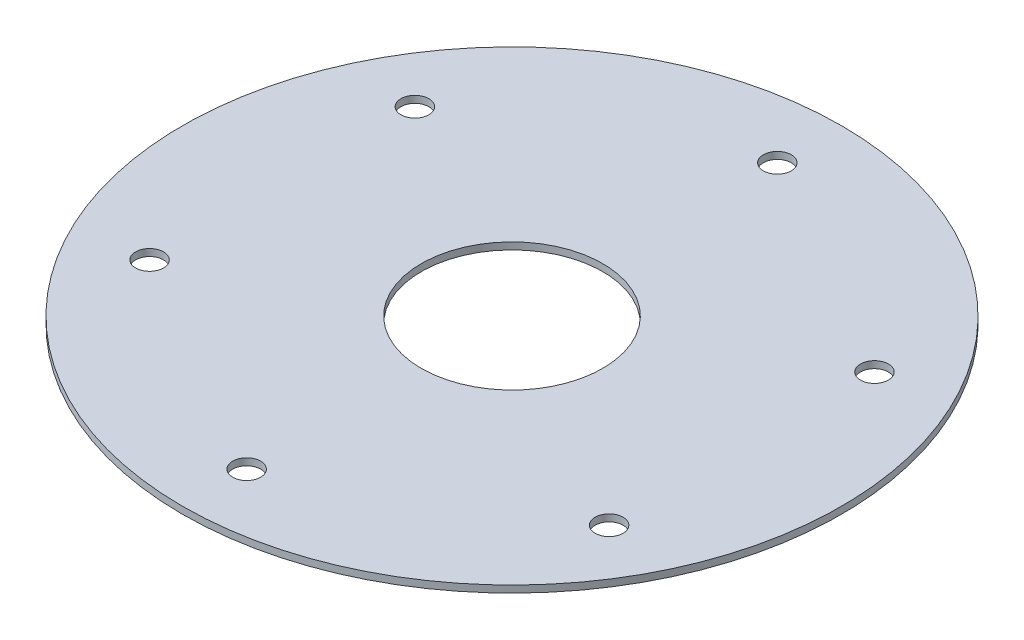
ISO-10303-21;
HEADER;
FILE_DESCRIPTION(('STEP AP214'),'2;1');
FILE_NAME('part.step','',(''),(''),'','','');
FILE_SCHEMA(('AUTOMOTIVE_DESIGN { 1 0 10303 214 1 1 1 1 }'));
ENDSEC;
DATA;
#1=APPLICATION_CONTEXT('core data for automotive mechanical design processes');
#2=APPLICATION_PROTOCOL_DEFINITION('international standard','automotive_design',2000,#1);
#3=PRODUCT_CONTEXT('',#1,'mechanical');
#4=PRODUCT('Part','Part','',(#3));
#5=PRODUCT_RELATED_PRODUCT_CATEGORY('part','',(#4));
#6=PRODUCT_DEFINITION_FORMATION('','',#4);
#7=PRODUCT_DEFINITION_CONTEXT('part definition',#1,'design');
#8=PRODUCT_DEFINITION('design','',#6,#7);
#9=PRODUCT_DEFINITION_SHAPE('','',#8);
#10=(LENGTH_UNIT() NAMED_UNIT(*) SI_UNIT(.MILLI.,.METRE.));
#11=(NAMED_UNIT(*) PLANE_ANGLE_UNIT() SI_UNIT($,.RADIAN.));
#12=(NAMED_UNIT(*) SI_UNIT($,.STERADIAN.) SOLID_ANGLE_UNIT());
#13=UNCERTAINTY_MEASURE_WITH_UNIT(LENGTH_MEASURE(1.E-05),#10,'distance_accuracy_value','');
#14=(GEOMETRIC_REPRESENTATION_CONTEXT(3) GLOBAL_UNCERTAINTY_ASSIGNED_CONTEXT((#13)) GLOBAL_UNIT_ASSIGNED_CONTEXT((#10,
#11,#12)) REPRESENTATION_CONTEXT('',''));
#15=CARTESIAN_POINT('',(0.,0.,0.));
#16=DIRECTION('',(0.,0.,1.));
#17=DIRECTION('',(1.,0.,0.));
#18=AXIS2_PLACEMENT_3D('',#15,#16,#17);
#19=CARTESIAN_POINT('',(0.,1.,0.));
#20=DIRECTION('',(0.,-1.,0.));
#21=DIRECTION('',(0.,0.,-1.));
#22=AXIS2_PLACEMENT_3D('',#19,#20,#21);
#23=CYLINDRICAL_SURFACE('',#22,47.2);
#24=CARTESIAN_POINT('',(0.,1.,0.));
#25=DIRECTION('',(0.,1.,0.));
#26=DIRECTION('',(0.,0.,1.));
#27=AXIS2_PLACEMENT_3D('',#24,#25,#26);
#28=CIRCLE('',#27,47.2);
#29=CARTESIAN_POINT('',(0.,1.,47.2));
#30=VERTEX_POINT('',#29);
#31=EDGE_CURVE('E10',#30,#30,#28,.T.);
#32=ORIENTED_EDGE('',*,*,#31,.F.);
#33=EDGE_LOOP('',(#32));
#34=FACE_BOUND('',#33,.T.);
#35=CARTESIAN_POINT('',(0.,0.,0.));
#36=DIRECTION('',(0.,1.,0.));
#37=DIRECTION('',(0.,0.,1.));
#38=AXIS2_PLACEMENT_3D('',#35,#36,#37);
#39=CIRCLE('',#38,47.2);
#40=CARTESIAN_POINT('',(0.,0.,47.2));
#41=VERTEX_POINT('',#40);
#42=EDGE_CURVE('E40',#41,#41,#39,.T.);
#43=ORIENTED_EDGE('',*,*,#42,.T.);
#44=EDGE_LOOP('',(#43));
#45=FACE_BOUND('',#44,.T.);
#46=ADVANCED_FACE('F37',(#34,#45),#23,.T.);
#47=CARTESIAN_POINT('',(0.,1.,0.));
#48=DIRECTION('',(0.,1.,0.));
#49=DIRECTION('',(0.,0.,1.));
#50=AXIS2_PLACEMENT_3D('',#47,#48,#49);
#51=PLANE('',#50);
#52=CARTESIAN_POINT('',(32.9089653438084,1.,-19.0000000000004));
#53=DIRECTION('',(0.,1.,0.));
#54=DIRECTION('',(-0.866025403784433,0.,0.50000000000001));
#55=AXIS2_PLACEMENT_3D('',#52,#53,#54);
#56=CIRCLE('',#55,2.);
#57=CARTESIAN_POINT('',(31.1769145362396,1.,-18.0000000000004));
#58=VERTEX_POINT('',#57);
#59=EDGE_CURVE('E75',#58,#58,#56,.T.);
#60=ORIENTED_EDGE('',*,*,#59,.F.);
#61=EDGE_LOOP('',(#60));
#62=FACE_BOUND('',#61,.T.);
#63=CARTESIAN_POINT('',(32.9089653438088,1.,18.9999999999997));
#64=DIRECTION('',(0.,1.,0.));
#65=DIRECTION('',(-0.866025403784443,0.,-0.499999999999992));
#66=AXIS2_PLACEMENT_3D('',#63,#64,#65);
#67=CIRCLE('',#66,2.);
#68=CARTESIAN_POINT('',(31.17691453624,1.,17.9999999999997));
#69=VERTEX_POINT('',#68);
#70=EDGE_CURVE('E83',#69,#69,#67,.T.);
#71=ORIENTED_EDGE('',*,*,#70,.F.);
#72=EDGE_LOOP('',(#71));
#73=FACE_BOUND('',#72,.T.);
#74=CARTESIAN_POINT('',(0.,1.,38.));
#75=DIRECTION('',(0.,1.,0.));
#76=DIRECTION('',(0.,0.,-1.));
#77=AXIS2_PLACEMENT_3D('',#74,#75,#76);
#78=CIRCLE('',#77,2.);
#79=CARTESIAN_POINT('',(0.,1.,36.));
#80=VERTEX_POINT('',#79);
#81=EDGE_CURVE('E91',#80,#80,#78,.T.);
#82=ORIENTED_EDGE('',*,*,#81,.F.);
#83=EDGE_LOOP('',(#82));
#84=FACE_BOUND('',#83,.T.);
#85=CARTESIAN_POINT('',(-32.9089653438086,1.,19.0000000000002));
#86=DIRECTION('',(0.,1.,0.));
#87=DIRECTION('',(0.866025403784436,0.,-0.500000000000004));
#88=AXIS2_PLACEMENT_3D('',#85,#86,#87);
#89=CIRCLE('',#88,2.);
#90=CARTESIAN_POINT('',(-31.1769145362397,1.,18.0000000000001));
#91=VERTEX_POINT('',#90);
#92=EDGE_CURVE('E99',#91,#91,#89,.T.);
#93=ORIENTED_EDGE('',*,*,#92,.F.);
#94=EDGE_LOOP('',(#93));
#95=FACE_BOUND('',#94,.T.);
#96=CARTESIAN_POINT('',(-32.9089653438087,1.,-18.9999999999999));
#97=DIRECTION('',(0.,1.,0.));
#98=DIRECTION('',(0.86602540378444,0.,0.499999999999998));
#99=AXIS2_PLACEMENT_3D('',#96,#97,#98);
#100=CIRCLE('',#99,2.);
#101=CARTESIAN_POINT('',(-31.1769145362398,1.,-17.9999999999999));
#102=VERTEX_POINT('',#101);
#103=EDGE_CURVE('E67',#102,#102,#100,.T.);
#104=ORIENTED_EDGE('',*,*,#103,.F.);
#105=EDGE_LOOP('',(#104));
#106=FACE_BOUND('',#105,.T.);
#107=CARTESIAN_POINT('',(0.,1.,-38.));
#108=DIRECTION('',(0.,1.,0.));
#109=DIRECTION('',(0.,0.,1.));
#110=AXIS2_PLACEMENT_3D('',#107,#108,#109);
#111=CIRCLE('',#110,2.);
#112=CARTESIAN_POINT('',(0.,1.,-36.));
#113=VERTEX_POINT('',#112);
#114=EDGE_CURVE('E59',#113,#113,#111,.T.);
#115=ORIENTED_EDGE('',*,*,#114,.F.);
#116=EDGE_LOOP('',(#115));
#117=FACE_BOUND('',#116,.T.);
#118=CARTESIAN_POINT('',(0.,1.,0.));
#119=DIRECTION('',(0.,1.,0.));
#120=DIRECTION('',(0.,0.,1.));
#121=AXIS2_PLACEMENT_3D('',#118,#119,#120);
#122=CIRCLE('',#121,13.);
#123=CARTESIAN_POINT('',(0.,1.,13.));
#124=VERTEX_POINT('',#123);
#125=EDGE_CURVE('E51',#124,#124,#122,.T.);
#126=ORIENTED_EDGE('',*,*,#125,.F.);
#127=EDGE_LOOP('',(#126));
#128=FACE_BOUND('',#127,.T.);
#129=ORIENTED_EDGE('',*,*,#31,.T.);
#130=EDGE_LOOP('',(#129));
#131=FACE_BOUND('',#130,.T.);
#132=ADVANCED_FACE('F118',(#62,#73,#84,#95,#106,#117,#128,#131),#51,.T.);
#133=CARTESIAN_POINT('',(0.,0.,0.));
#134=DIRECTION('',(0.,1.,0.));
#135=DIRECTION('',(0.,0.,1.));
#136=AXIS2_PLACEMENT_3D('',#133,#134,#135);
#137=PLANE('',#136);
#138=CARTESIAN_POINT('',(32.9089653438084,0.,-19.0000000000004));
#139=DIRECTION('',(0.,1.,0.));
#140=DIRECTION('',(-0.866025403784433,0.,0.50000000000001));
#141=AXIS2_PLACEMENT_3D('',#138,#139,#140);
#142=CIRCLE('',#141,2.);
#143=CARTESIAN_POINT('',(31.1769145362396,0.,-18.0000000000004));
#144=VERTEX_POINT('',#143);
#145=EDGE_CURVE('E79',#144,#144,#142,.T.);
#146=ORIENTED_EDGE('',*,*,#145,.T.);
#147=EDGE_LOOP('',(#146));
#148=FACE_BOUND('',#147,.T.);
#149=CARTESIAN_POINT('',(32.9089653438088,0.,18.9999999999997));
#150=DIRECTION('',(0.,1.,0.));
#151=DIRECTION('',(-0.866025403784443,0.,-0.499999999999992));
#152=AXIS2_PLACEMENT_3D('',#149,#150,#151);
#153=CIRCLE('',#152,2.);
#154=CARTESIAN_POINT('',(31.17691453624,0.,17.9999999999997));
#155=VERTEX_POINT('',#154);
#156=EDGE_CURVE('E87',#155,#155,#153,.T.);
#157=ORIENTED_EDGE('',*,*,#156,.T.);
#158=EDGE_LOOP('',(#157));
#159=FACE_BOUND('',#158,.T.);
#160=CARTESIAN_POINT('',(0.,0.,38.));
#161=DIRECTION('',(0.,1.,0.));
#162=DIRECTION('',(0.,0.,-1.));
#163=AXIS2_PLACEMENT_3D('',#160,#161,#162);
#164=CIRCLE('',#163,2.);
#165=CARTESIAN_POINT('',(0.,0.,36.));
#166=VERTEX_POINT('',#165);
#167=EDGE_CURVE('E95',#166,#166,#164,.T.);
#168=ORIENTED_EDGE('',*,*,#167,.T.);
#169=EDGE_LOOP('',(#168));
#170=FACE_BOUND('',#169,.T.);
#171=CARTESIAN_POINT('',(-32.9089653438086,0.,19.0000000000002));
#172=DIRECTION('',(0.,1.,0.));
#173=DIRECTION('',(0.866025403784436,0.,-0.500000000000004));
#174=AXIS2_PLACEMENT_3D('',#171,#172,#173);
#175=CIRCLE('',#174,2.);
#176=CARTESIAN_POINT('',(-31.1769145362397,0.,18.0000000000001));
#177=VERTEX_POINT('',#176);
#178=EDGE_CURVE('E71',#177,#177,#175,.T.);
#179=ORIENTED_EDGE('',*,*,#178,.T.);
#180=EDGE_LOOP('',(#179));
#181=FACE_BOUND('',#180,.T.);
#182=CARTESIAN_POINT('',(-32.9089653438087,0.,-18.9999999999999));
#183=DIRECTION('',(0.,1.,0.));
#184=DIRECTION('',(0.86602540378444,0.,0.499999999999998));
#185=AXIS2_PLACEMENT_3D('',#182,#183,#184);
#186=CIRCLE('',#185,2.);
#187=CARTESIAN_POINT('',(-31.1769145362398,0.,-17.9999999999999));
#188=VERTEX_POINT('',#187);
#189=EDGE_CURVE('E63',#188,#188,#186,.T.);
#190=ORIENTED_EDGE('',*,*,#189,.T.);
#191=EDGE_LOOP('',(#190));
#192=FACE_BOUND('',#191,.T.);
#193=CARTESIAN_POINT('',(0.,0.,-38.));
#194=DIRECTION('',(0.,1.,0.));
#195=DIRECTION('',(0.,0.,1.));
#196=AXIS2_PLACEMENT_3D('',#193,#194,#195);
#197=CIRCLE('',#196,2.);
#198=CARTESIAN_POINT('',(0.,0.,-36.));
#199=VERTEX_POINT('',#198);
#200=EDGE_CURVE('E55',#199,#199,#197,.T.);
#201=ORIENTED_EDGE('',*,*,#200,.T.);
#202=EDGE_LOOP('',(#201));
#203=FACE_BOUND('',#202,.T.);
#204=CARTESIAN_POINT('',(0.,0.,0.));
#205=DIRECTION('',(0.,1.,0.));
#206=DIRECTION('',(0.,0.,1.));
#207=AXIS2_PLACEMENT_3D('',#204,#205,#206);
#208=CIRCLE('',#207,13.);
#209=CARTESIAN_POINT('',(0.,0.,13.));
#210=VERTEX_POINT('',#209);
#211=EDGE_CURVE('E49',#210,#210,#208,.T.);
#212=ORIENTED_EDGE('',*,*,#211,.T.);
#213=EDGE_LOOP('',(#212));
#214=FACE_BOUND('',#213,.T.);
#215=ORIENTED_EDGE('',*,*,#42,.F.);
#216=EDGE_LOOP('',(#215));
#217=FACE_BOUND('',#216,.T.);
#218=ADVANCED_FACE('F107',(#148,#159,#170,#181,#192,#203,#214,#217),#137,.F.);
#219=CARTESIAN_POINT('',(0.,0.,0.));
#220=DIRECTION('',(0.,1.,0.));
#221=DIRECTION('',(0.,0.,1.));
#222=AXIS2_PLACEMENT_3D('',#219,#220,#221);
#223=CYLINDRICAL_SURFACE('',#222,13.);
#224=ORIENTED_EDGE('',*,*,#211,.F.);
#225=EDGE_LOOP('',(#224));
#226=FACE_BOUND('',#225,.T.);
#227=ORIENTED_EDGE('',*,*,#125,.T.);
#228=EDGE_LOOP('',(#227));
#229=FACE_BOUND('',#228,.T.);
#230=ADVANCED_FACE('F129',(#226,#229),#223,.F.);
#231=CARTESIAN_POINT('',(0.,0.,-38.));
#232=DIRECTION('',(0.,1.,0.));
#233=DIRECTION('',(0.,0.,1.));
#234=AXIS2_PLACEMENT_3D('',#231,#232,#233);
#235=CYLINDRICAL_SURFACE('',#234,2.);
#236=ORIENTED_EDGE('',*,*,#200,.F.);
#237=EDGE_LOOP('',(#236));
#238=FACE_BOUND('',#237,.T.);
#239=ORIENTED_EDGE('',*,*,#114,.T.);
#240=EDGE_LOOP('',(#239));
#241=FACE_BOUND('',#240,.T.);
#242=ADVANCED_FACE('F131',(#238,#241),#235,.F.);
#243=CARTESIAN_POINT('',(-32.9089653438087,0.,-18.9999999999999));
#244=DIRECTION('',(0.,1.,0.));
#245=DIRECTION('',(0.,0.,1.));
#246=AXIS2_PLACEMENT_3D('',#243,#244,#245);
#247=CYLINDRICAL_SURFACE('',#246,2.);
#248=ORIENTED_EDGE('',*,*,#189,.F.);
#249=EDGE_LOOP('',(#248));
#250=FACE_BOUND('',#249,.T.);
#251=ORIENTED_EDGE('',*,*,#103,.T.);
#252=EDGE_LOOP('',(#251));
#253=FACE_BOUND('',#252,.T.);
#254=ADVANCED_FACE('F114',(#250,#253),#247,.F.);
#255=CARTESIAN_POINT('',(-32.9089653438086,0.,19.0000000000002));
#256=DIRECTION('',(0.,1.,0.));
#257=DIRECTION('',(0.,0.,1.));
#258=AXIS2_PLACEMENT_3D('',#255,#256,#257);
#259=CYLINDRICAL_SURFACE('',#258,2.);
#260=ORIENTED_EDGE('',*,*,#178,.F.);
#261=EDGE_LOOP('',(#260));
#262=FACE_BOUND('',#261,.T.);
#263=ORIENTED_EDGE('',*,*,#92,.T.);
#264=EDGE_LOOP('',(#263));
#265=FACE_BOUND('',#264,.T.);
#266=ADVANCED_FACE('F110',(#262,#265),#259,.F.);
#267=CARTESIAN_POINT('',(0.,0.,38.));
#268=DIRECTION('',(0.,1.,0.));
#269=DIRECTION('',(0.,0.,1.));
#270=AXIS2_PLACEMENT_3D('',#267,#268,#269);
#271=CYLINDRICAL_SURFACE('',#270,2.);
#272=ORIENTED_EDGE('',*,*,#167,.F.);
#273=EDGE_LOOP('',(#272));
#274=FACE_BOUND('',#273,.T.);
#275=ORIENTED_EDGE('',*,*,#81,.T.);
#276=EDGE_LOOP('',(#275));
#277=FACE_BOUND('',#276,.T.);
#278=ADVANCED_FACE('F113',(#274,#277),#271,.F.);
#279=CARTESIAN_POINT('',(32.9089653438088,0.,18.9999999999997));
#280=DIRECTION('',(0.,1.,0.));
#281=DIRECTION('',(0.,0.,1.));
#282=AXIS2_PLACEMENT_3D('',#279,#280,#281);
#283=CYLINDRICAL_SURFACE('',#282,2.);
#284=ORIENTED_EDGE('',*,*,#156,.F.);
#285=EDGE_LOOP('',(#284));
#286=FACE_BOUND('',#285,.T.);
#287=ORIENTED_EDGE('',*,*,#70,.T.);
#288=EDGE_LOOP('',(#287));
#289=FACE_BOUND('',#288,.T.);
#290=ADVANCED_FACE('F184',(#286,#289),#283,.F.);
#291=CARTESIAN_POINT('',(32.9089653438084,0.,-19.0000000000004));
#292=DIRECTION('',(0.,1.,0.));
#293=DIRECTION('',(0.,0.,1.));
#294=AXIS2_PLACEMENT_3D('',#291,#292,#293);
#295=CYLINDRICAL_SURFACE('',#294,2.);
#296=ORIENTED_EDGE('',*,*,#145,.F.);
#297=EDGE_LOOP('',(#296));
#298=FACE_BOUND('',#297,.T.);
#299=ORIENTED_EDGE('',*,*,#59,.T.);
#300=EDGE_LOOP('',(#299));
#301=FACE_BOUND('',#300,.T.);
#302=ADVANCED_FACE('F194',(#298,#301),#295,.F.);
#303=CLOSED_SHELL('',(#46,#132,#218,#230,#242,#254,#266,#278,#290,#302));
#304=MANIFOLD_SOLID_BREP('B2',#303);
#305=ADVANCED_BREP_SHAPE_REPRESENTATION('',(#18,#304),#14);
#306=SHAPE_DEFINITION_REPRESENTATION(#9,#305);
ENDSEC;
END-ISO-10303-21;
